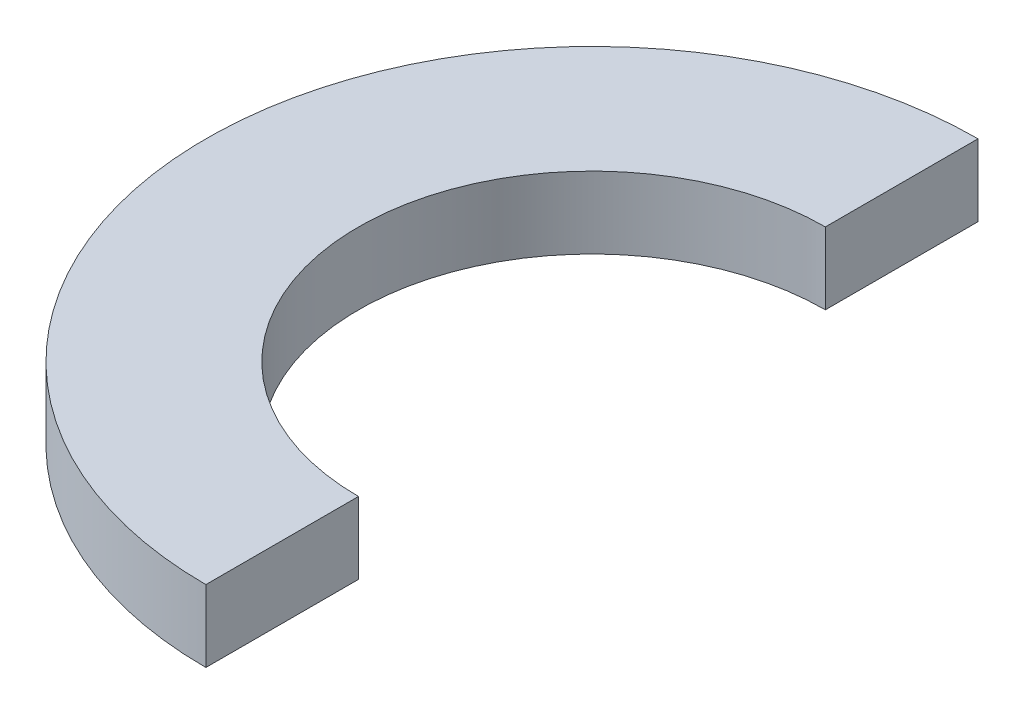
ISO-10303-21;
HEADER;
FILE_DESCRIPTION(('STEP AP214'),'2;1');
FILE_NAME('part.step','',(''),(''),'','','');
FILE_SCHEMA(('AUTOMOTIVE_DESIGN { 1 0 10303 214 1 1 1 1 }'));
ENDSEC;
DATA;
#1=APPLICATION_CONTEXT('core data for automotive mechanical design processes');
#2=APPLICATION_PROTOCOL_DEFINITION('international standard','automotive_design',2000,#1);
#3=PRODUCT_CONTEXT('',#1,'mechanical');
#4=PRODUCT('Part','Part','',(#3));
#5=PRODUCT_RELATED_PRODUCT_CATEGORY('part','',(#4));
#6=PRODUCT_DEFINITION_FORMATION('','',#4);
#7=PRODUCT_DEFINITION_CONTEXT('part definition',#1,'design');
#8=PRODUCT_DEFINITION('design','',#6,#7);
#9=PRODUCT_DEFINITION_SHAPE('','',#8);
#10=(LENGTH_UNIT() NAMED_UNIT(*) SI_UNIT(.MILLI.,.METRE.));
#11=(NAMED_UNIT(*) PLANE_ANGLE_UNIT() SI_UNIT($,.RADIAN.));
#12=(NAMED_UNIT(*) SI_UNIT($,.STERADIAN.) SOLID_ANGLE_UNIT());
#13=UNCERTAINTY_MEASURE_WITH_UNIT(LENGTH_MEASURE(1.E-05),#10,'distance_accuracy_value','');
#14=(GEOMETRIC_REPRESENTATION_CONTEXT(3) GLOBAL_UNCERTAINTY_ASSIGNED_CONTEXT((#13)) GLOBAL_UNIT_ASSIGNED_CONTEXT((#10,
#11,#12)) REPRESENTATION_CONTEXT('',''));
#15=CARTESIAN_POINT('',(0.,0.,0.));
#16=DIRECTION('',(0.,0.,1.));
#17=DIRECTION('',(1.,0.,0.));
#18=AXIS2_PLACEMENT_3D('',#15,#16,#17);
#19=CARTESIAN_POINT('',(110.,151.5,135.));
#20=DIRECTION('',(0.,1.,0.));
#21=DIRECTION('',(1.,0.,0.));
#22=AXIS2_PLACEMENT_3D('',#19,#20,#21);
#23=CYLINDRICAL_SURFACE('',#22,2.6);
#24=CARTESIAN_POINT('',(110.,152.4,135.));
#25=DIRECTION('',(0.,-1.,0.));
#26=DIRECTION('',(1.,0.,0.));
#27=AXIS2_PLACEMENT_3D('',#24,#25,#26);
#28=CIRCLE('',#27,2.6);
#29=CARTESIAN_POINT('',(110.,152.4,137.6));
#30=VERTEX_POINT('',#29);
#31=CARTESIAN_POINT('',(110.,152.4,132.4));
#32=VERTEX_POINT('',#31);
#33=EDGE_CURVE('E101',#30,#32,#28,.T.);
#34=ORIENTED_EDGE('',*,*,#33,.F.);
#35=DIRECTION('',(0.,1.,0.));
#36=VECTOR('',#35,1.);
#37=CARTESIAN_POINT('',(110.,151.5,137.6));
#38=LINE('',#37,#36);
#39=CARTESIAN_POINT('',(110.,151.6,137.6));
#40=VERTEX_POINT('',#39);
#41=EDGE_CURVE('E11',#40,#30,#38,.T.);
#42=ORIENTED_EDGE('',*,*,#41,.F.);
#43=CARTESIAN_POINT('',(110.,151.6,135.));
#44=DIRECTION('',(0.,-1.,0.));
#45=DIRECTION('',(1.,0.,0.));
#46=AXIS2_PLACEMENT_3D('',#43,#44,#45);
#47=CIRCLE('',#46,2.6);
#48=CARTESIAN_POINT('',(110.,151.6,132.4));
#49=VERTEX_POINT('',#48);
#50=EDGE_CURVE('E20',#40,#49,#47,.T.);
#51=ORIENTED_EDGE('',*,*,#50,.T.);
#52=DIRECTION('',(0.,1.,0.));
#53=VECTOR('',#52,1.);
#54=CARTESIAN_POINT('',(110.,151.5,132.4));
#55=LINE('',#54,#53);
#56=EDGE_CURVE('E74',#49,#32,#55,.T.);
#57=ORIENTED_EDGE('',*,*,#56,.T.);
#58=EDGE_LOOP('',(#34,#42,#51,#57));
#59=FACE_BOUND('',#58,.T.);
#60=ADVANCED_FACE('F16',(#59),#23,.F.);
#61=CARTESIAN_POINT('',(110.,153.,130.));
#62=DIRECTION('',(1.,0.,0.));
#63=DIRECTION('',(0.,1.,0.));
#64=AXIS2_PLACEMENT_3D('',#61,#62,#63);
#65=PLANE('',#64);
#66=ORIENTED_EDGE('',*,*,#41,.T.);
#67=DIRECTION('',(0.,0.,1.));
#68=VECTOR('',#67,1.);
#69=CARTESIAN_POINT('',(110.,152.4,132.5));
#70=LINE('',#69,#68);
#71=CARTESIAN_POINT('',(110.,152.4,139.3));
#72=VERTEX_POINT('',#71);
#73=EDGE_CURVE('E100',#30,#72,#70,.T.);
#74=ORIENTED_EDGE('',*,*,#73,.T.);
#75=DIRECTION('',(0.,1.,0.));
#76=VECTOR('',#75,1.);
#77=CARTESIAN_POINT('',(110.,151.6,139.3));
#78=LINE('',#77,#76);
#79=CARTESIAN_POINT('',(110.,151.6,139.3));
#80=VERTEX_POINT('',#79);
#81=EDGE_CURVE('E85',#80,#72,#78,.T.);
#82=ORIENTED_EDGE('',*,*,#81,.F.);
#83=DIRECTION('',(0.,0.,1.));
#84=VECTOR('',#83,1.);
#85=CARTESIAN_POINT('',(110.,151.6,132.5));
#86=LINE('',#85,#84);
#87=EDGE_CURVE('E77',#40,#80,#86,.T.);
#88=ORIENTED_EDGE('',*,*,#87,.F.);
#89=EDGE_LOOP('',(#66,#74,#82,#88));
#90=FACE_BOUND('',#89,.T.);
#91=ADVANCED_FACE('F119',(#90),#65,.T.);
#92=CARTESIAN_POINT('',(110.,151.6,135.));
#93=DIRECTION('',(0.,1.,0.));
#94=DIRECTION('',(0.,0.,-1.));
#95=AXIS2_PLACEMENT_3D('',#92,#93,#94);
#96=PLANE('',#95);
#97=ORIENTED_EDGE('',*,*,#87,.T.);
#98=CARTESIAN_POINT('',(110.,151.6,135.));
#99=DIRECTION('',(0.,-1.,0.));
#100=DIRECTION('',(1.,0.,0.));
#101=AXIS2_PLACEMENT_3D('',#98,#99,#100);
#102=CIRCLE('',#101,4.3);
#103=CARTESIAN_POINT('',(110.,151.6,130.7));
#104=VERTEX_POINT('',#103);
#105=EDGE_CURVE('E79',#80,#104,#102,.T.);
#106=ORIENTED_EDGE('',*,*,#105,.T.);
#107=DIRECTION('',(0.,0.,1.));
#108=VECTOR('',#107,1.);
#109=CARTESIAN_POINT('',(110.,151.6,132.5));
#110=LINE('',#109,#108);
#111=EDGE_CURVE('E68',#104,#49,#110,.T.);
#112=ORIENTED_EDGE('',*,*,#111,.T.);
#113=ORIENTED_EDGE('',*,*,#50,.F.);
#114=EDGE_LOOP('',(#97,#106,#112,#113));
#115=FACE_BOUND('',#114,.T.);
#116=ADVANCED_FACE('F18',(#115),#96,.F.);
#117=CARTESIAN_POINT('',(110.,153.,130.));
#118=DIRECTION('',(1.,0.,0.));
#119=DIRECTION('',(0.,1.,0.));
#120=AXIS2_PLACEMENT_3D('',#117,#118,#119);
#121=PLANE('',#120);
#122=DIRECTION('',(0.,0.,1.));
#123=VECTOR('',#122,1.);
#124=CARTESIAN_POINT('',(110.,152.4,132.5));
#125=LINE('',#124,#123);
#126=CARTESIAN_POINT('',(110.,152.4,130.7));
#127=VERTEX_POINT('',#126);
#128=EDGE_CURVE('E97',#127,#32,#125,.T.);
#129=ORIENTED_EDGE('',*,*,#128,.T.);
#130=ORIENTED_EDGE('',*,*,#56,.F.);
#131=ORIENTED_EDGE('',*,*,#111,.F.);
#132=DIRECTION('',(0.,1.,0.));
#133=VECTOR('',#132,1.);
#134=CARTESIAN_POINT('',(110.,151.6,130.7));
#135=LINE('',#134,#133);
#136=EDGE_CURVE('E73',#104,#127,#135,.T.);
#137=ORIENTED_EDGE('',*,*,#136,.T.);
#138=EDGE_LOOP('',(#129,#130,#131,#137));
#139=FACE_BOUND('',#138,.T.);
#140=ADVANCED_FACE('F71',(#139),#121,.T.);
#141=CARTESIAN_POINT('',(110.,152.4,135.));
#142=DIRECTION('',(0.,1.,0.));
#143=DIRECTION('',(0.,0.,-1.));
#144=AXIS2_PLACEMENT_3D('',#141,#142,#143);
#145=PLANE('',#144);
#146=ORIENTED_EDGE('',*,*,#33,.T.);
#147=ORIENTED_EDGE('',*,*,#128,.F.);
#148=CARTESIAN_POINT('',(110.,152.4,135.));
#149=DIRECTION('',(0.,-1.,0.));
#150=DIRECTION('',(1.,0.,0.));
#151=AXIS2_PLACEMENT_3D('',#148,#149,#150);
#152=CIRCLE('',#151,4.3);
#153=EDGE_CURVE('E90',#72,#127,#152,.T.);
#154=ORIENTED_EDGE('',*,*,#153,.F.);
#155=ORIENTED_EDGE('',*,*,#73,.F.);
#156=EDGE_LOOP('',(#146,#147,#154,#155));
#157=FACE_BOUND('',#156,.T.);
#158=ADVANCED_FACE('F133',(#157),#145,.T.);
#159=CARTESIAN_POINT('',(110.,151.6,135.));
#160=DIRECTION('',(0.,1.,0.));
#161=DIRECTION('',(1.,0.,0.));
#162=AXIS2_PLACEMENT_3D('',#159,#160,#161);
#163=CYLINDRICAL_SURFACE('',#162,4.3);
#164=ORIENTED_EDGE('',*,*,#136,.F.);
#165=ORIENTED_EDGE('',*,*,#105,.F.);
#166=ORIENTED_EDGE('',*,*,#81,.T.);
#167=ORIENTED_EDGE('',*,*,#153,.T.);
#168=EDGE_LOOP('',(#164,#165,#166,#167));
#169=FACE_BOUND('',#168,.T.);
#170=ADVANCED_FACE('F88',(#169),#163,.T.);
#171=CLOSED_SHELL('',(#60,#91,#116,#140,#158,#170));
#172=MANIFOLD_SOLID_BREP('B1',#171);
#173=ADVANCED_BREP_SHAPE_REPRESENTATION('',(#18,#172),#14);
#174=SHAPE_DEFINITION_REPRESENTATION(#9,#173);
ENDSEC;
END-ISO-10303-21;
